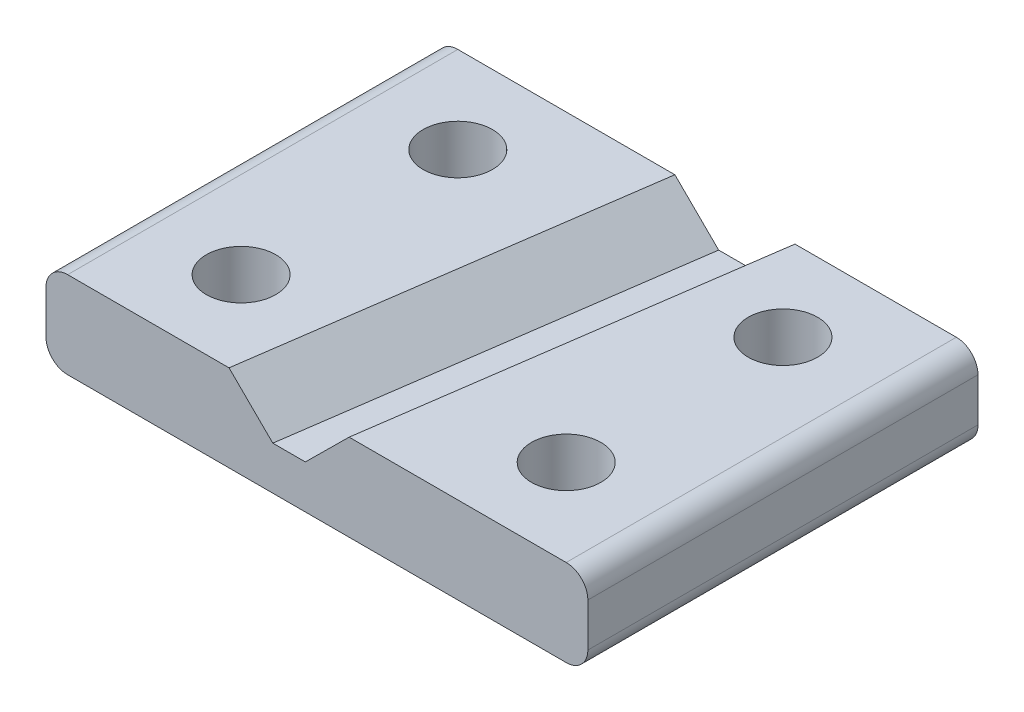
ISO-10303-21;
HEADER;
FILE_DESCRIPTION(('STEP AP214'),'2;1');
FILE_NAME('part.step','',(''),(''),'','','');
FILE_SCHEMA(('AUTOMOTIVE_DESIGN { 1 0 10303 214 1 1 1 1 }'));
ENDSEC;
DATA;
#1=APPLICATION_CONTEXT('core data for automotive mechanical design processes');
#2=APPLICATION_PROTOCOL_DEFINITION('international standard','automotive_design',2000,#1);
#3=PRODUCT_CONTEXT('',#1,'mechanical');
#4=PRODUCT('Part','Part','',(#3));
#5=PRODUCT_RELATED_PRODUCT_CATEGORY('part','',(#4));
#6=PRODUCT_DEFINITION_FORMATION('','',#4);
#7=PRODUCT_DEFINITION_CONTEXT('part definition',#1,'design');
#8=PRODUCT_DEFINITION('design','',#6,#7);
#9=PRODUCT_DEFINITION_SHAPE('','',#8);
#10=(LENGTH_UNIT() NAMED_UNIT(*) SI_UNIT(.MILLI.,.METRE.));
#11=(NAMED_UNIT(*) PLANE_ANGLE_UNIT() SI_UNIT($,.RADIAN.));
#12=(NAMED_UNIT(*) SI_UNIT($,.STERADIAN.) SOLID_ANGLE_UNIT());
#13=UNCERTAINTY_MEASURE_WITH_UNIT(LENGTH_MEASURE(1.E-05),#10,'distance_accuracy_value','');
#14=(GEOMETRIC_REPRESENTATION_CONTEXT(3) GLOBAL_UNCERTAINTY_ASSIGNED_CONTEXT((#13)) GLOBAL_UNIT_ASSIGNED_CONTEXT((#10,
#11,#12)) REPRESENTATION_CONTEXT('',''));
#15=CARTESIAN_POINT('',(0.,0.,0.));
#16=DIRECTION('',(0.,0.,1.));
#17=DIRECTION('',(1.,0.,0.));
#18=AXIS2_PLACEMENT_3D('',#15,#16,#17);
#19=CARTESIAN_POINT('',(12.5,2.,18.));
#20=DIRECTION('',(0.,-1.,0.));
#21=DIRECTION('',(1.,0.,0.));
#22=AXIS2_PLACEMENT_3D('',#19,#20,#21);
#23=PLANE('',#22);
#24=CARTESIAN_POINT('',(7.5,2.,4.));
#25=DIRECTION('',(0.,-1.,0.));
#26=DIRECTION('',(-1.,0.,0.));
#27=AXIS2_PLACEMENT_3D('',#24,#25,#26);
#28=CIRCLE('',#27,1.6);
#29=CARTESIAN_POINT('',(5.9,2.,4.));
#30=VERTEX_POINT('',#29);
#31=EDGE_CURVE('E267',#30,#30,#28,.T.);
#32=ORIENTED_EDGE('',*,*,#31,.T.);
#33=EDGE_LOOP('',(#32));
#34=FACE_BOUND('',#33,.T.);
#35=CARTESIAN_POINT('',(7.5,2.,14.));
#36=DIRECTION('',(0.,-1.,0.));
#37=DIRECTION('',(-1.,0.,0.));
#38=AXIS2_PLACEMENT_3D('',#35,#36,#37);
#39=CIRCLE('',#38,1.6);
#40=CARTESIAN_POINT('',(5.9,2.,14.));
#41=VERTEX_POINT('',#40);
#42=EDGE_CURVE('E251',#41,#41,#39,.T.);
#43=ORIENTED_EDGE('',*,*,#42,.T.);
#44=EDGE_LOOP('',(#43));
#45=FACE_BOUND('',#44,.T.);
#46=DIRECTION('',(-1.,0.,0.));
#47=VECTOR('',#46,1.);
#48=CARTESIAN_POINT('',(12.5,2.,0.));
#49=LINE('',#48,#47);
#50=CARTESIAN_POINT('',(11.5,2.,0.));
#51=VERTEX_POINT('',#50);
#52=CARTESIAN_POINT('',(4.0556561004624,2.,0.));
#53=VERTEX_POINT('',#52);
#54=EDGE_CURVE('E149',#51,#53,#49,.T.);
#55=ORIENTED_EDGE('',*,*,#54,.T.);
#56=DIRECTION('',(0.141391705181755,0.,-0.98995372907313));
#57=VECTOR('',#56,1.);
#58=CARTESIAN_POINT('',(1.70498974218521,2.,16.4581856070828));
#59=LINE('',#58,#57);
#60=CARTESIAN_POINT('',(1.48477766591732,2.,18.));
#61=VERTEX_POINT('',#60);
#62=EDGE_CURVE('E219',#53,#61,#59,.F.);
#63=ORIENTED_EDGE('',*,*,#62,.T.);
#64=DIRECTION('',(-1.,0.,0.));
#65=VECTOR('',#64,1.);
#66=CARTESIAN_POINT('',(12.5,2.,18.));
#67=LINE('',#66,#65);
#68=CARTESIAN_POINT('',(11.5,2.,18.));
#69=VERTEX_POINT('',#68);
#70=EDGE_CURVE('E151',#69,#61,#67,.T.);
#71=ORIENTED_EDGE('',*,*,#70,.F.);
#72=DIRECTION('',(0.,0.,-1.));
#73=VECTOR('',#72,1.);
#74=CARTESIAN_POINT('',(11.5,2.,18.));
#75=LINE('',#74,#73);
#76=EDGE_CURVE('E137',#69,#51,#75,.T.);
#77=ORIENTED_EDGE('',*,*,#76,.T.);
#78=EDGE_LOOP('',(#55,#63,#71,#77));
#79=FACE_BOUND('',#78,.T.);
#80=ADVANCED_FACE('F47',(#34,#45,#79),#23,.F.);
#81=CARTESIAN_POINT('',(-12.5,-2.,18.));
#82=DIRECTION('',(1.,0.,0.));
#83=DIRECTION('',(0.,0.,-1.));
#84=AXIS2_PLACEMENT_3D('',#81,#82,#83);
#85=PLANE('',#84);
#86=DIRECTION('',(0.,-1.,0.));
#87=VECTOR('',#86,1.);
#88=CARTESIAN_POINT('',(-12.5,-2.,18.));
#89=LINE('',#88,#87);
#90=CARTESIAN_POINT('',(-12.5,1.,18.));
#91=VERTEX_POINT('',#90);
#92=CARTESIAN_POINT('',(-12.5,-1.,18.));
#93=VERTEX_POINT('',#92);
#94=EDGE_CURVE('E161',#91,#93,#89,.T.);
#95=ORIENTED_EDGE('',*,*,#94,.F.);
#96=DIRECTION('',(0.,0.,-1.));
#97=VECTOR('',#96,1.);
#98=CARTESIAN_POINT('',(-12.5,1.,18.));
#99=LINE('',#98,#97);
#100=CARTESIAN_POINT('',(-12.5,1.,0.));
#101=VERTEX_POINT('',#100);
#102=EDGE_CURVE('E209',#91,#101,#99,.T.);
#103=ORIENTED_EDGE('',*,*,#102,.T.);
#104=DIRECTION('',(0.,-1.,0.));
#105=VECTOR('',#104,1.);
#106=CARTESIAN_POINT('',(-12.5,-2.,0.));
#107=LINE('',#106,#105);
#108=CARTESIAN_POINT('',(-12.5,-1.,0.));
#109=VERTEX_POINT('',#108);
#110=EDGE_CURVE('E282',#101,#109,#107,.T.);
#111=ORIENTED_EDGE('',*,*,#110,.T.);
#112=DIRECTION('',(0.,0.,-1.));
#113=VECTOR('',#112,1.);
#114=CARTESIAN_POINT('',(-12.5,-1.,18.));
#115=LINE('',#114,#113);
#116=EDGE_CURVE('E206',#109,#93,#115,.F.);
#117=ORIENTED_EDGE('',*,*,#116,.T.);
#118=EDGE_LOOP('',(#95,#103,#111,#117));
#119=FACE_BOUND('',#118,.T.);
#120=ADVANCED_FACE('F323',(#119),#85,.F.);
#121=CARTESIAN_POINT('',(12.5,-2.,18.));
#122=DIRECTION('',(0.,1.,0.));
#123=DIRECTION('',(-1.,0.,0.));
#124=AXIS2_PLACEMENT_3D('',#121,#122,#123);
#125=PLANE('',#124);
#126=CARTESIAN_POINT('',(7.5,-2.,14.));
#127=DIRECTION('',(0.,-1.,0.));
#128=DIRECTION('',(-1.,0.,0.));
#129=AXIS2_PLACEMENT_3D('',#126,#127,#128);
#130=CIRCLE('',#129,1.6);
#131=CARTESIAN_POINT('',(5.9,-2.,14.));
#132=VERTEX_POINT('',#131);
#133=EDGE_CURVE('E271',#132,#132,#130,.T.);
#134=ORIENTED_EDGE('',*,*,#133,.F.);
#135=EDGE_LOOP('',(#134));
#136=FACE_BOUND('',#135,.T.);
#137=CARTESIAN_POINT('',(7.5,-2.,4.));
#138=DIRECTION('',(0.,-1.,0.));
#139=DIRECTION('',(-1.,0.,0.));
#140=AXIS2_PLACEMENT_3D('',#137,#138,#139);
#141=CIRCLE('',#140,1.6);
#142=CARTESIAN_POINT('',(5.9,-2.,4.));
#143=VERTEX_POINT('',#142);
#144=EDGE_CURVE('E263',#143,#143,#141,.T.);
#145=ORIENTED_EDGE('',*,*,#144,.F.);
#146=EDGE_LOOP('',(#145));
#147=FACE_BOUND('',#146,.T.);
#148=CARTESIAN_POINT('',(-7.5,-2.,4.));
#149=DIRECTION('',(0.,-1.,0.));
#150=DIRECTION('',(1.,0.,0.));
#151=AXIS2_PLACEMENT_3D('',#148,#149,#150);
#152=CIRCLE('',#151,1.6);
#153=CARTESIAN_POINT('',(-5.9,-2.,4.));
#154=VERTEX_POINT('',#153);
#155=EDGE_CURVE('E254',#154,#154,#152,.T.);
#156=ORIENTED_EDGE('',*,*,#155,.F.);
#157=EDGE_LOOP('',(#156));
#158=FACE_BOUND('',#157,.T.);
#159=CARTESIAN_POINT('',(-7.5,-2.,14.));
#160=DIRECTION('',(0.,-1.,0.));
#161=DIRECTION('',(1.,0.,0.));
#162=AXIS2_PLACEMENT_3D('',#159,#160,#161);
#163=CIRCLE('',#162,1.6);
#164=CARTESIAN_POINT('',(-5.9,-2.,14.));
#165=VERTEX_POINT('',#164);
#166=EDGE_CURVE('E258',#165,#165,#163,.T.);
#167=ORIENTED_EDGE('',*,*,#166,.F.);
#168=EDGE_LOOP('',(#167));
#169=FACE_BOUND('',#168,.T.);
#170=DIRECTION('',(1.,0.,0.));
#171=VECTOR('',#170,1.);
#172=CARTESIAN_POINT('',(12.5,-2.,0.));
#173=LINE('',#172,#171);
#174=CARTESIAN_POINT('',(-11.5,-2.,0.));
#175=VERTEX_POINT('',#174);
#176=CARTESIAN_POINT('',(11.5,-2.,0.));
#177=VERTEX_POINT('',#176);
#178=EDGE_CURVE('E297',#175,#177,#173,.T.);
#179=ORIENTED_EDGE('',*,*,#178,.T.);
#180=DIRECTION('',(0.,0.,-1.));
#181=VECTOR('',#180,1.);
#182=CARTESIAN_POINT('',(11.5,-2.,18.));
#183=LINE('',#182,#181);
#184=CARTESIAN_POINT('',(11.5,-2.,18.));
#185=VERTEX_POINT('',#184);
#186=EDGE_CURVE('E203',#177,#185,#183,.F.);
#187=ORIENTED_EDGE('',*,*,#186,.T.);
#188=DIRECTION('',(1.,0.,0.));
#189=VECTOR('',#188,1.);
#190=CARTESIAN_POINT('',(12.5,-2.,18.));
#191=LINE('',#190,#189);
#192=CARTESIAN_POINT('',(-11.5,-2.,18.));
#193=VERTEX_POINT('',#192);
#194=EDGE_CURVE('E166',#193,#185,#191,.T.);
#195=ORIENTED_EDGE('',*,*,#194,.F.);
#196=DIRECTION('',(0.,0.,-1.));
#197=VECTOR('',#196,1.);
#198=CARTESIAN_POINT('',(-11.5,-2.,18.));
#199=LINE('',#198,#197);
#200=EDGE_CURVE('E199',#193,#175,#199,.T.);
#201=ORIENTED_EDGE('',*,*,#200,.T.);
#202=EDGE_LOOP('',(#179,#187,#195,#201));
#203=FACE_BOUND('',#202,.T.);
#204=ADVANCED_FACE('F312',(#136,#147,#158,#169,#203),#125,.F.);
#205=CARTESIAN_POINT('',(12.5,-2.,18.));
#206=DIRECTION('',(-1.,0.,0.));
#207=DIRECTION('',(0.,0.,1.));
#208=AXIS2_PLACEMENT_3D('',#205,#206,#207);
#209=PLANE('',#208);
#210=DIRECTION('',(0.,1.,0.));
#211=VECTOR('',#210,1.);
#212=CARTESIAN_POINT('',(12.5,-2.,0.));
#213=LINE('',#212,#211);
#214=CARTESIAN_POINT('',(12.5,-0.999999999999998,0.));
#215=VERTEX_POINT('',#214);
#216=CARTESIAN_POINT('',(12.5,1.,0.));
#217=VERTEX_POINT('',#216);
#218=EDGE_CURVE('E168',#215,#217,#213,.T.);
#219=ORIENTED_EDGE('',*,*,#218,.T.);
#220=DIRECTION('',(0.,0.,-1.));
#221=VECTOR('',#220,1.);
#222=CARTESIAN_POINT('',(12.5,1.,18.));
#223=LINE('',#222,#221);
#224=CARTESIAN_POINT('',(12.5,1.,18.));
#225=VERTEX_POINT('',#224);
#226=EDGE_CURVE('E138',#217,#225,#223,.F.);
#227=ORIENTED_EDGE('',*,*,#226,.T.);
#228=DIRECTION('',(0.,1.,0.));
#229=VECTOR('',#228,1.);
#230=CARTESIAN_POINT('',(12.5,-2.,18.));
#231=LINE('',#230,#229);
#232=CARTESIAN_POINT('',(12.5,-0.999999999999998,18.));
#233=VERTEX_POINT('',#232);
#234=EDGE_CURVE('E289',#233,#225,#231,.T.);
#235=ORIENTED_EDGE('',*,*,#234,.F.);
#236=DIRECTION('',(0.,0.,-1.));
#237=VECTOR('',#236,1.);
#238=CARTESIAN_POINT('',(12.5,-0.999999999999998,18.));
#239=LINE('',#238,#237);
#240=EDGE_CURVE('E143',#233,#215,#239,.T.);
#241=ORIENTED_EDGE('',*,*,#240,.T.);
#242=EDGE_LOOP('',(#219,#227,#235,#241));
#243=FACE_BOUND('',#242,.T.);
#244=ADVANCED_FACE('F305',(#243),#209,.F.);
#245=CARTESIAN_POINT('',(-7.5,2.,4.));
#246=DIRECTION('',(0.,-1.,0.));
#247=DIRECTION('',(1.,0.,0.));
#248=AXIS2_PLACEMENT_3D('',#245,#246,#247);
#249=CIRCLE('',#248,1.6);
#250=CARTESIAN_POINT('',(-5.9,2.,4.));
#251=VERTEX_POINT('',#250);
#252=EDGE_CURVE('E259',#251,#251,#249,.T.);
#253=ORIENTED_EDGE('',*,*,#252,.T.);
#254=EDGE_LOOP('',(#253));
#255=FACE_BOUND('',#254,.T.);
#256=CARTESIAN_POINT('',(-7.5,2.,14.));
#257=DIRECTION('',(0.,-1.,0.));
#258=DIRECTION('',(1.,0.,0.));
#259=AXIS2_PLACEMENT_3D('',#256,#257,#258);
#260=CIRCLE('',#259,1.6);
#261=CARTESIAN_POINT('',(-5.9,2.,14.));
#262=VERTEX_POINT('',#261);
#263=EDGE_CURVE('E278',#262,#262,#260,.T.);
#264=ORIENTED_EDGE('',*,*,#263,.T.);
#265=EDGE_LOOP('',(#264));
#266=FACE_BOUND('',#265,.T.);
#267=CARTESIAN_POINT('',(-4.05565610046239,2.,18.));
#268=VERTEX_POINT('',#267);
#269=CARTESIAN_POINT('',(-11.5,2.,18.));
#270=VERTEX_POINT('',#269);
#271=EDGE_CURVE('E238',#268,#270,#67,.T.);
#272=ORIENTED_EDGE('',*,*,#271,.F.);
#273=DIRECTION('',(-0.141391705181755,0.,0.98995372907313));
#274=VECTOR('',#273,1.);
#275=CARTESIAN_POINT('',(-3.72468180931446,2.,15.6826841905043));
#276=LINE('',#275,#274);
#277=CARTESIAN_POINT('',(-1.48477766591732,2.,0.));
#278=VERTEX_POINT('',#277);
#279=EDGE_CURVE('E58',#268,#278,#276,.F.);
#280=ORIENTED_EDGE('',*,*,#279,.T.);
#281=CARTESIAN_POINT('',(-11.5,2.,0.));
#282=VERTEX_POINT('',#281);
#283=EDGE_CURVE('E63',#278,#282,#49,.T.);
#284=ORIENTED_EDGE('',*,*,#283,.T.);
#285=DIRECTION('',(0.,0.,-1.));
#286=VECTOR('',#285,1.);
#287=CARTESIAN_POINT('',(-11.5,2.,18.));
#288=LINE('',#287,#286);
#289=EDGE_CURVE('E154',#282,#270,#288,.F.);
#290=ORIENTED_EDGE('',*,*,#289,.T.);
#291=EDGE_LOOP('',(#272,#280,#284,#290));
#292=FACE_BOUND('',#291,.T.);
#293=ADVANCED_FACE('F237',(#255,#266,#292),#23,.F.);
#294=CARTESIAN_POINT('',(0.,0.,18.));
#295=DIRECTION('',(0.,0.,1.));
#296=DIRECTION('',(1.,0.,0.));
#297=AXIS2_PLACEMENT_3D('',#294,#295,#296);
#298=PLANE('',#297);
#299=ORIENTED_EDGE('',*,*,#70,.T.);
#300=DIRECTION('',(0.710667549608938,0.703527990866624,0.));
#301=VECTOR('',#300,1.);
#302=CARTESIAN_POINT('',(0.742348691964347,1.26502966866332,18.));
#303=LINE('',#302,#301);
#304=CARTESIAN_POINT('',(-0.535518779526217,0.,18.));
#305=VERTEX_POINT('',#304);
#306=EDGE_CURVE('E222',#61,#305,#303,.F.);
#307=ORIENTED_EDGE('',*,*,#306,.T.);
#308=DIRECTION('',(1.,0.,0.));
#309=VECTOR('',#308,1.);
#310=CARTESIAN_POINT('',(3.,0.,18.));
#311=LINE('',#310,#309);
#312=CARTESIAN_POINT('',(-2.03535965501885,0.,18.));
#313=VERTEX_POINT('',#312);
#314=EDGE_CURVE('E248',#313,#305,#311,.T.);
#315=ORIENTED_EDGE('',*,*,#314,.F.);
#316=DIRECTION('',(0.710667549608938,-0.703527990866624,0.));
#317=VECTOR('',#316,1.);
#318=CARTESIAN_POINT('',(-0.742348691964316,-1.28002102460826,18.));
#319=LINE('',#318,#317);
#320=EDGE_CURVE('E230',#313,#268,#319,.F.);
#321=ORIENTED_EDGE('',*,*,#320,.T.);
#322=ORIENTED_EDGE('',*,*,#271,.T.);
#323=CARTESIAN_POINT('',(-11.5,1.,18.));
#324=DIRECTION('',(0.,0.,1.));
#325=DIRECTION('',(1.,0.,0.));
#326=AXIS2_PLACEMENT_3D('',#323,#324,#325);
#327=CIRCLE('',#326,1.);
#328=EDGE_CURVE('E190',#270,#91,#327,.T.);
#329=ORIENTED_EDGE('',*,*,#328,.T.);
#330=ORIENTED_EDGE('',*,*,#94,.T.);
#331=CARTESIAN_POINT('',(-11.5,-1.,18.));
#332=DIRECTION('',(0.,0.,1.));
#333=DIRECTION('',(1.,0.,0.));
#334=AXIS2_PLACEMENT_3D('',#331,#332,#333);
#335=CIRCLE('',#334,1.);
#336=EDGE_CURVE('E187',#93,#193,#335,.T.);
#337=ORIENTED_EDGE('',*,*,#336,.T.);
#338=ORIENTED_EDGE('',*,*,#194,.T.);
#339=CARTESIAN_POINT('',(11.5,-0.999999999999998,18.));
#340=DIRECTION('',(0.,0.,1.));
#341=DIRECTION('',(1.,0.,0.));
#342=AXIS2_PLACEMENT_3D('',#339,#340,#341);
#343=CIRCLE('',#342,1.);
#344=EDGE_CURVE('E193',#185,#233,#343,.T.);
#345=ORIENTED_EDGE('',*,*,#344,.T.);
#346=ORIENTED_EDGE('',*,*,#234,.T.);
#347=CARTESIAN_POINT('',(11.5,1.,18.));
#348=DIRECTION('',(0.,0.,1.));
#349=DIRECTION('',(1.,0.,0.));
#350=AXIS2_PLACEMENT_3D('',#347,#348,#349);
#351=CIRCLE('',#350,1.);
#352=EDGE_CURVE('E196',#225,#69,#351,.T.);
#353=ORIENTED_EDGE('',*,*,#352,.T.);
#354=EDGE_LOOP('',(#299,#307,#315,#321,#322,#329,#330,#337,#338,#345,#346,#353));
#355=FACE_BOUND('',#354,.T.);
#356=ADVANCED_FACE('F315',(#355),#298,.T.);
#357=CARTESIAN_POINT('',(0.,0.,0.));
#358=DIRECTION('',(0.,0.,1.));
#359=DIRECTION('',(1.,0.,0.));
#360=AXIS2_PLACEMENT_3D('',#357,#358,#359);
#361=PLANE('',#360);
#362=DIRECTION('',(-1.,0.,0.));
#363=VECTOR('',#362,1.);
#364=CARTESIAN_POINT('',(-3.,0.,0.));
#365=LINE('',#364,#363);
#366=CARTESIAN_POINT('',(2.03535965501885,0.,0.));
#367=VERTEX_POINT('',#366);
#368=CARTESIAN_POINT('',(0.535518779526219,0.,0.));
#369=VERTEX_POINT('',#368);
#370=EDGE_CURVE('E242',#367,#369,#365,.T.);
#371=ORIENTED_EDGE('',*,*,#370,.F.);
#372=DIRECTION('',(-0.710667549608938,-0.703527990866624,0.));
#373=VECTOR('',#372,1.);
#374=CARTESIAN_POINT('',(1.00740458689254,-1.01762795301126,0.));
#375=LINE('',#374,#373);
#376=EDGE_CURVE('E158',#367,#53,#375,.F.);
#377=ORIENTED_EDGE('',*,*,#376,.T.);
#378=ORIENTED_EDGE('',*,*,#54,.F.);
#379=CARTESIAN_POINT('',(11.5,1.,0.));
#380=DIRECTION('',(0.,0.,1.));
#381=DIRECTION('',(1.,0.,0.));
#382=AXIS2_PLACEMENT_3D('',#379,#380,#381);
#383=CIRCLE('',#382,1.);
#384=EDGE_CURVE('E133',#51,#217,#383,.F.);
#385=ORIENTED_EDGE('',*,*,#384,.T.);
#386=ORIENTED_EDGE('',*,*,#218,.F.);
#387=CARTESIAN_POINT('',(11.5,-0.999999999999998,0.));
#388=DIRECTION('',(0.,0.,1.));
#389=DIRECTION('',(1.,0.,0.));
#390=AXIS2_PLACEMENT_3D('',#387,#388,#389);
#391=CIRCLE('',#390,1.);
#392=EDGE_CURVE('E144',#215,#177,#391,.F.);
#393=ORIENTED_EDGE('',*,*,#392,.T.);
#394=ORIENTED_EDGE('',*,*,#178,.F.);
#395=CARTESIAN_POINT('',(-11.5,-1.,0.));
#396=DIRECTION('',(0.,0.,1.));
#397=DIRECTION('',(1.,0.,0.));
#398=AXIS2_PLACEMENT_3D('',#395,#396,#397);
#399=CIRCLE('',#398,1.);
#400=EDGE_CURVE('E153',#175,#109,#399,.F.);
#401=ORIENTED_EDGE('',*,*,#400,.T.);
#402=ORIENTED_EDGE('',*,*,#110,.F.);
#403=CARTESIAN_POINT('',(-11.5,1.,0.));
#404=DIRECTION('',(0.,0.,1.));
#405=DIRECTION('',(1.,0.,0.));
#406=AXIS2_PLACEMENT_3D('',#403,#404,#405);
#407=CIRCLE('',#406,1.);
#408=EDGE_CURVE('E177',#101,#282,#407,.F.);
#409=ORIENTED_EDGE('',*,*,#408,.T.);
#410=ORIENTED_EDGE('',*,*,#283,.F.);
#411=DIRECTION('',(-0.710667549608938,0.703527990866624,0.));
#412=VECTOR('',#411,1.);
#413=CARTESIAN_POINT('',(0.265055894928216,0.267745741183666,0.));
#414=LINE('',#413,#412);
#415=EDGE_CURVE('E11',#278,#369,#414,.F.);
#416=ORIENTED_EDGE('',*,*,#415,.T.);
#417=EDGE_LOOP('',(#371,#377,#378,#385,#386,#393,#394,#401,#402,#409,#410,#416));
#418=FACE_BOUND('',#417,.T.);
#419=ADVANCED_FACE('F157',(#418),#361,.F.);
#420=CARTESIAN_POINT('',(11.5,1.,18.));
#421=DIRECTION('',(0.,0.,-1.));
#422=DIRECTION('',(-1.,0.,0.));
#423=AXIS2_PLACEMENT_3D('',#420,#421,#422);
#424=CYLINDRICAL_SURFACE('',#423,1.);
#425=ORIENTED_EDGE('',*,*,#352,.F.);
#426=ORIENTED_EDGE('',*,*,#226,.F.);
#427=ORIENTED_EDGE('',*,*,#384,.F.);
#428=ORIENTED_EDGE('',*,*,#76,.F.);
#429=EDGE_LOOP('',(#425,#426,#427,#428));
#430=FACE_BOUND('',#429,.T.);
#431=ADVANCED_FACE('F136',(#430),#424,.T.);
#432=CARTESIAN_POINT('',(11.5,-0.999999999999998,18.));
#433=DIRECTION('',(0.,0.,-1.));
#434=DIRECTION('',(-1.,0.,0.));
#435=AXIS2_PLACEMENT_3D('',#432,#433,#434);
#436=CYLINDRICAL_SURFACE('',#435,1.);
#437=ORIENTED_EDGE('',*,*,#344,.F.);
#438=ORIENTED_EDGE('',*,*,#186,.F.);
#439=ORIENTED_EDGE('',*,*,#392,.F.);
#440=ORIENTED_EDGE('',*,*,#240,.F.);
#441=EDGE_LOOP('',(#437,#438,#439,#440));
#442=FACE_BOUND('',#441,.T.);
#443=ADVANCED_FACE('F310',(#442),#436,.T.);
#444=CARTESIAN_POINT('',(-11.5,1.,18.));
#445=DIRECTION('',(0.,0.,-1.));
#446=DIRECTION('',(-1.,0.,0.));
#447=AXIS2_PLACEMENT_3D('',#444,#445,#446);
#448=CYLINDRICAL_SURFACE('',#447,1.);
#449=ORIENTED_EDGE('',*,*,#328,.F.);
#450=ORIENTED_EDGE('',*,*,#289,.F.);
#451=ORIENTED_EDGE('',*,*,#408,.F.);
#452=ORIENTED_EDGE('',*,*,#102,.F.);
#453=EDGE_LOOP('',(#449,#450,#451,#452));
#454=FACE_BOUND('',#453,.T.);
#455=ADVANCED_FACE('F327',(#454),#448,.T.);
#456=CARTESIAN_POINT('',(-11.5,-1.,18.));
#457=DIRECTION('',(0.,0.,-1.));
#458=DIRECTION('',(-1.,0.,0.));
#459=AXIS2_PLACEMENT_3D('',#456,#457,#458);
#460=CYLINDRICAL_SURFACE('',#459,1.);
#461=ORIENTED_EDGE('',*,*,#336,.F.);
#462=ORIENTED_EDGE('',*,*,#116,.F.);
#463=ORIENTED_EDGE('',*,*,#400,.F.);
#464=ORIENTED_EDGE('',*,*,#200,.F.);
#465=EDGE_LOOP('',(#461,#462,#463,#464));
#466=FACE_BOUND('',#465,.T.);
#467=ADVANCED_FACE('F320',(#466),#460,.T.);
#468=CARTESIAN_POINT('',(-7.5,2.,14.));
#469=DIRECTION('',(0.,-1.,0.));
#470=DIRECTION('',(1.,0.,0.));
#471=AXIS2_PLACEMENT_3D('',#468,#469,#470);
#472=CYLINDRICAL_SURFACE('',#471,1.6);
#473=ORIENTED_EDGE('',*,*,#263,.F.);
#474=EDGE_LOOP('',(#473));
#475=FACE_BOUND('',#474,.T.);
#476=ORIENTED_EDGE('',*,*,#166,.T.);
#477=EDGE_LOOP('',(#476));
#478=FACE_BOUND('',#477,.T.);
#479=ADVANCED_FACE('F364',(#475,#478),#472,.F.);
#480=CARTESIAN_POINT('',(-7.5,2.,4.));
#481=DIRECTION('',(0.,-1.,0.));
#482=DIRECTION('',(1.,0.,0.));
#483=AXIS2_PLACEMENT_3D('',#480,#481,#482);
#484=CYLINDRICAL_SURFACE('',#483,1.6);
#485=ORIENTED_EDGE('',*,*,#252,.F.);
#486=EDGE_LOOP('',(#485));
#487=FACE_BOUND('',#486,.T.);
#488=ORIENTED_EDGE('',*,*,#155,.T.);
#489=EDGE_LOOP('',(#488));
#490=FACE_BOUND('',#489,.T.);
#491=ADVANCED_FACE('F367',(#487,#490),#484,.F.);
#492=CARTESIAN_POINT('',(7.5,2.,4.));
#493=DIRECTION('',(0.,-1.,0.));
#494=DIRECTION('',(1.,0.,0.));
#495=AXIS2_PLACEMENT_3D('',#492,#493,#494);
#496=CYLINDRICAL_SURFACE('',#495,1.6);
#497=ORIENTED_EDGE('',*,*,#31,.F.);
#498=EDGE_LOOP('',(#497));
#499=FACE_BOUND('',#498,.T.);
#500=ORIENTED_EDGE('',*,*,#144,.T.);
#501=EDGE_LOOP('',(#500));
#502=FACE_BOUND('',#501,.T.);
#503=ADVANCED_FACE('F450',(#499,#502),#496,.F.);
#504=CARTESIAN_POINT('',(7.5,2.,14.));
#505=DIRECTION('',(0.,-1.,0.));
#506=DIRECTION('',(1.,0.,0.));
#507=AXIS2_PLACEMENT_3D('',#504,#505,#506);
#508=CYLINDRICAL_SURFACE('',#507,1.6);
#509=ORIENTED_EDGE('',*,*,#42,.F.);
#510=EDGE_LOOP('',(#509));
#511=FACE_BOUND('',#510,.T.);
#512=ORIENTED_EDGE('',*,*,#133,.T.);
#513=EDGE_LOOP('',(#512));
#514=FACE_BOUND('',#513,.T.);
#515=ADVANCED_FACE('F340',(#511,#514),#508,.F.);
#516=CARTESIAN_POINT('',(0.,0.,0.));
#517=DIRECTION('',(0.,-1.,0.));
#518=DIRECTION('',(1.,0.,0.));
#519=AXIS2_PLACEMENT_3D('',#516,#517,#518);
#520=PLANE('',#519);
#521=ORIENTED_EDGE('',*,*,#370,.T.);
#522=DIRECTION('',(-0.141391705181755,0.,0.98995372907313));
#523=VECTOR('',#522,1.);
#524=CARTESIAN_POINT('',(-2.10604038278905,0.,18.4948709681361));
#525=LINE('',#524,#523);
#526=EDGE_CURVE('E226',#369,#313,#525,.T.);
#527=ORIENTED_EDGE('',*,*,#526,.T.);
#528=ORIENTED_EDGE('',*,*,#314,.T.);
#529=DIRECTION('',(0.141391705181755,0.,-0.98995372907313));
#530=VECTOR('',#529,1.);
#531=CARTESIAN_POINT('',(2.10604038278906,0.,-0.49487096813615));
#532=LINE('',#531,#530);
#533=EDGE_CURVE('E213',#305,#367,#532,.T.);
#534=ORIENTED_EDGE('',*,*,#533,.T.);
#535=EDGE_LOOP('',(#521,#527,#528,#534));
#536=FACE_BOUND('',#535,.T.);
#537=ADVANCED_FACE('F244',(#536),#520,.F.);
#538=CARTESIAN_POINT('',(1.99466952984573,0.,0.284891826573586));
#539=DIRECTION('',(-0.700002994888517,0.707106781186551,-0.0999790335375473));
#540=DIRECTION('',(-0.141391705181755,0.,0.98995372907313));
#541=AXIS2_PLACEMENT_3D('',#538,#539,#540);
#542=PLANE('',#541);
#543=ORIENTED_EDGE('',*,*,#306,.F.);
#544=ORIENTED_EDGE('',*,*,#62,.F.);
#545=ORIENTED_EDGE('',*,*,#376,.F.);
#546=ORIENTED_EDGE('',*,*,#533,.F.);
#547=EDGE_LOOP('',(#543,#544,#545,#546));
#548=FACE_BOUND('',#547,.T.);
#549=ADVANCED_FACE('F332',(#548),#542,.T.);
#550=CARTESIAN_POINT('',(0.524812894638628,0.,0.0749572307220902));
#551=DIRECTION('',(0.700002994888517,0.707106781186552,0.0999790335375473));
#552=DIRECTION('',(0.141391705181755,0.,-0.98995372907313));
#553=AXIS2_PLACEMENT_3D('',#550,#551,#552);
#554=PLANE('',#553);
#555=ORIENTED_EDGE('',*,*,#415,.F.);
#556=ORIENTED_EDGE('',*,*,#279,.F.);
#557=ORIENTED_EDGE('',*,*,#320,.F.);
#558=ORIENTED_EDGE('',*,*,#526,.F.);
#559=EDGE_LOOP('',(#555,#556,#557,#558));
#560=FACE_BOUND('',#559,.T.);
#561=ADVANCED_FACE('F50',(#560),#554,.T.);
#562=CLOSED_SHELL('',(#80,#120,#204,#244,#293,#356,#419,#431,#443,#455,#467,#479,#491,#503,#515,
#537,#549,#561));
#563=MANIFOLD_SOLID_BREP('B2',#562);
#564=ADVANCED_BREP_SHAPE_REPRESENTATION('',(#18,#563),#14);
#565=SHAPE_DEFINITION_REPRESENTATION(#9,#564);
ENDSEC;
END-ISO-10303-21;
